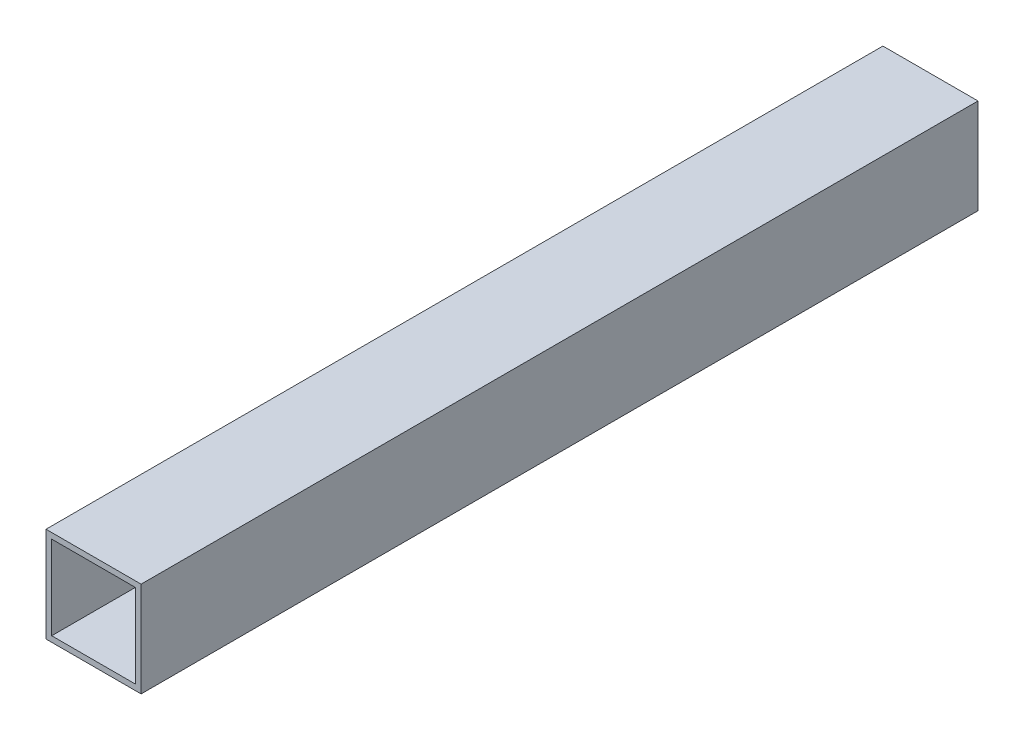
ISO-10303-21;
HEADER;
FILE_DESCRIPTION(('STEP AP214'),'2;1');
FILE_NAME('part.step','',(''),(''),'','','');
FILE_SCHEMA(('AUTOMOTIVE_DESIGN { 1 0 10303 214 1 1 1 1 }'));
ENDSEC;
DATA;
#1=APPLICATION_CONTEXT('core data for automotive mechanical design processes');
#2=APPLICATION_PROTOCOL_DEFINITION('international standard','automotive_design',2000,#1);
#3=PRODUCT_CONTEXT('',#1,'mechanical');
#4=PRODUCT('Part','Part','',(#3));
#5=PRODUCT_RELATED_PRODUCT_CATEGORY('part','',(#4));
#6=PRODUCT_DEFINITION_FORMATION('','',#4);
#7=PRODUCT_DEFINITION_CONTEXT('part definition',#1,'design');
#8=PRODUCT_DEFINITION('design','',#6,#7);
#9=PRODUCT_DEFINITION_SHAPE('','',#8);
#10=(LENGTH_UNIT() NAMED_UNIT(*) SI_UNIT(.MILLI.,.METRE.));
#11=(NAMED_UNIT(*) PLANE_ANGLE_UNIT() SI_UNIT($,.RADIAN.));
#12=(NAMED_UNIT(*) SI_UNIT($,.STERADIAN.) SOLID_ANGLE_UNIT());
#13=UNCERTAINTY_MEASURE_WITH_UNIT(LENGTH_MEASURE(1.E-05),#10,'distance_accuracy_value','');
#14=(GEOMETRIC_REPRESENTATION_CONTEXT(3) GLOBAL_UNCERTAINTY_ASSIGNED_CONTEXT((#13)) GLOBAL_UNIT_ASSIGNED_CONTEXT((#10,
#11,#12)) REPRESENTATION_CONTEXT('',''));
#15=CARTESIAN_POINT('',(0.,0.,0.));
#16=DIRECTION('',(0.,0.,1.));
#17=DIRECTION('',(1.,0.,0.));
#18=AXIS2_PLACEMENT_3D('',#15,#16,#17);
#19=CARTESIAN_POINT('',(0.,0.,220.));
#20=DIRECTION('',(0.,0.,1.));
#21=DIRECTION('',(1.,0.,0.));
#22=AXIS2_PLACEMENT_3D('',#19,#20,#21);
#23=PLANE('',#22);
#24=DIRECTION('',(0.,1.,0.));
#25=VECTOR('',#24,1.);
#26=CARTESIAN_POINT('',(12.5,-12.5,220.));
#27=LINE('',#26,#25);
#28=CARTESIAN_POINT('',(12.5,-12.5,220.));
#29=VERTEX_POINT('',#28);
#30=CARTESIAN_POINT('',(12.5,12.5,220.));
#31=VERTEX_POINT('',#30);
#32=EDGE_CURVE('E157',#29,#31,#27,.T.);
#33=ORIENTED_EDGE('',*,*,#32,.T.);
#34=DIRECTION('',(-1.,0.,0.));
#35=VECTOR('',#34,1.);
#36=CARTESIAN_POINT('',(-12.5,12.5,220.));
#37=LINE('',#36,#35);
#38=CARTESIAN_POINT('',(-12.5,12.5,220.));
#39=VERTEX_POINT('',#38);
#40=EDGE_CURVE('E160',#31,#39,#37,.T.);
#41=ORIENTED_EDGE('',*,*,#40,.T.);
#42=DIRECTION('',(0.,-1.,0.));
#43=VECTOR('',#42,1.);
#44=CARTESIAN_POINT('',(-12.5,-12.5,220.));
#45=LINE('',#44,#43);
#46=CARTESIAN_POINT('',(-12.5,-12.5,220.));
#47=VERTEX_POINT('',#46);
#48=EDGE_CURVE('E163',#39,#47,#45,.T.);
#49=ORIENTED_EDGE('',*,*,#48,.T.);
#50=DIRECTION('',(1.,0.,0.));
#51=VECTOR('',#50,1.);
#52=CARTESIAN_POINT('',(-12.5,-12.5,220.));
#53=LINE('',#52,#51);
#54=EDGE_CURVE('E165',#47,#29,#53,.T.);
#55=ORIENTED_EDGE('',*,*,#54,.T.);
#56=EDGE_LOOP('',(#33,#41,#49,#55));
#57=FACE_BOUND('',#56,.T.);
#58=DIRECTION('',(-1.,0.,0.));
#59=VECTOR('',#58,1.);
#60=CARTESIAN_POINT('',(0.,11.,220.));
#61=LINE('',#60,#59);
#62=CARTESIAN_POINT('',(11.,11.,220.));
#63=VERTEX_POINT('',#62);
#64=CARTESIAN_POINT('',(-11.,11.,220.));
#65=VERTEX_POINT('',#64);
#66=EDGE_CURVE('E129',#63,#65,#61,.T.);
#67=ORIENTED_EDGE('',*,*,#66,.F.);
#68=DIRECTION('',(0.,1.,0.));
#69=VECTOR('',#68,1.);
#70=CARTESIAN_POINT('',(11.,0.,220.));
#71=LINE('',#70,#69);
#72=CARTESIAN_POINT('',(11.,-11.,220.));
#73=VERTEX_POINT('',#72);
#74=EDGE_CURVE('E121',#73,#63,#71,.T.);
#75=ORIENTED_EDGE('',*,*,#74,.F.);
#76=DIRECTION('',(1.,0.,0.));
#77=VECTOR('',#76,1.);
#78=CARTESIAN_POINT('',(0.,-11.,220.));
#79=LINE('',#78,#77);
#80=CARTESIAN_POINT('',(-11.,-11.,220.));
#81=VERTEX_POINT('',#80);
#82=EDGE_CURVE('E143',#81,#73,#79,.T.);
#83=ORIENTED_EDGE('',*,*,#82,.F.);
#84=DIRECTION('',(0.,-1.,0.));
#85=VECTOR('',#84,1.);
#86=CARTESIAN_POINT('',(-11.,0.,220.));
#87=LINE('',#86,#85);
#88=EDGE_CURVE('E141',#65,#81,#87,.T.);
#89=ORIENTED_EDGE('',*,*,#88,.F.);
#90=EDGE_LOOP('',(#67,#75,#83,#89));
#91=FACE_BOUND('',#90,.T.);
#92=ADVANCED_FACE('F56',(#57,#91),#23,.T.);
#93=CARTESIAN_POINT('',(0.,0.,0.));
#94=DIRECTION('',(0.,0.,1.));
#95=DIRECTION('',(1.,0.,0.));
#96=AXIS2_PLACEMENT_3D('',#93,#94,#95);
#97=PLANE('',#96);
#98=DIRECTION('',(0.,1.,0.));
#99=VECTOR('',#98,1.);
#100=CARTESIAN_POINT('',(12.5,-12.5,0.));
#101=LINE('',#100,#99);
#102=CARTESIAN_POINT('',(12.5,-12.5,0.));
#103=VERTEX_POINT('',#102);
#104=CARTESIAN_POINT('',(12.5,12.5,0.));
#105=VERTEX_POINT('',#104);
#106=EDGE_CURVE('E137',#103,#105,#101,.T.);
#107=ORIENTED_EDGE('',*,*,#106,.F.);
#108=DIRECTION('',(1.,0.,0.));
#109=VECTOR('',#108,1.);
#110=CARTESIAN_POINT('',(-12.5,-12.5,0.));
#111=LINE('',#110,#109);
#112=CARTESIAN_POINT('',(-12.5,-12.5,0.));
#113=VERTEX_POINT('',#112);
#114=EDGE_CURVE('E161',#113,#103,#111,.T.);
#115=ORIENTED_EDGE('',*,*,#114,.F.);
#116=DIRECTION('',(0.,-1.,0.));
#117=VECTOR('',#116,1.);
#118=CARTESIAN_POINT('',(-12.5,-12.5,0.));
#119=LINE('',#118,#117);
#120=CARTESIAN_POINT('',(-12.5,12.5,0.));
#121=VERTEX_POINT('',#120);
#122=EDGE_CURVE('E172',#121,#113,#119,.T.);
#123=ORIENTED_EDGE('',*,*,#122,.F.);
#124=DIRECTION('',(-1.,0.,0.));
#125=VECTOR('',#124,1.);
#126=CARTESIAN_POINT('',(-12.5,12.5,0.));
#127=LINE('',#126,#125);
#128=EDGE_CURVE('E170',#105,#121,#127,.T.);
#129=ORIENTED_EDGE('',*,*,#128,.F.);
#130=EDGE_LOOP('',(#107,#115,#123,#129));
#131=FACE_BOUND('',#130,.T.);
#132=DIRECTION('',(0.,1.,0.));
#133=VECTOR('',#132,1.);
#134=CARTESIAN_POINT('',(11.,0.,0.));
#135=LINE('',#134,#133);
#136=CARTESIAN_POINT('',(11.,-11.,0.));
#137=VERTEX_POINT('',#136);
#138=CARTESIAN_POINT('',(11.,11.,0.));
#139=VERTEX_POINT('',#138);
#140=EDGE_CURVE('E79',#137,#139,#135,.T.);
#141=ORIENTED_EDGE('',*,*,#140,.T.);
#142=DIRECTION('',(-1.,0.,0.));
#143=VECTOR('',#142,1.);
#144=CARTESIAN_POINT('',(0.,11.,0.));
#145=LINE('',#144,#143);
#146=CARTESIAN_POINT('',(-11.,11.,0.));
#147=VERTEX_POINT('',#146);
#148=EDGE_CURVE('E136',#139,#147,#145,.T.);
#149=ORIENTED_EDGE('',*,*,#148,.T.);
#150=DIRECTION('',(0.,-1.,0.));
#151=VECTOR('',#150,1.);
#152=CARTESIAN_POINT('',(-11.,0.,0.));
#153=LINE('',#152,#151);
#154=CARTESIAN_POINT('',(-11.,-11.,0.));
#155=VERTEX_POINT('',#154);
#156=EDGE_CURVE('E149',#147,#155,#153,.T.);
#157=ORIENTED_EDGE('',*,*,#156,.T.);
#158=DIRECTION('',(1.,0.,0.));
#159=VECTOR('',#158,1.);
#160=CARTESIAN_POINT('',(0.,-11.,0.));
#161=LINE('',#160,#159);
#162=EDGE_CURVE('E130',#155,#137,#161,.T.);
#163=ORIENTED_EDGE('',*,*,#162,.T.);
#164=EDGE_LOOP('',(#141,#149,#157,#163));
#165=FACE_BOUND('',#164,.T.);
#166=ADVANCED_FACE('F190',(#131,#165),#97,.F.);
#167=CARTESIAN_POINT('',(12.5,-12.5,220.));
#168=DIRECTION('',(-1.,0.,0.));
#169=DIRECTION('',(0.,0.,1.));
#170=AXIS2_PLACEMENT_3D('',#167,#168,#169);
#171=PLANE('',#170);
#172=ORIENTED_EDGE('',*,*,#106,.T.);
#173=DIRECTION('',(0.,0.,-1.));
#174=VECTOR('',#173,1.);
#175=CARTESIAN_POINT('',(12.5,12.5,220.));
#176=LINE('',#175,#174);
#177=EDGE_CURVE('E12',#31,#105,#176,.T.);
#178=ORIENTED_EDGE('',*,*,#177,.F.);
#179=ORIENTED_EDGE('',*,*,#32,.F.);
#180=DIRECTION('',(0.,0.,-1.));
#181=VECTOR('',#180,1.);
#182=CARTESIAN_POINT('',(12.5,-12.5,220.));
#183=LINE('',#182,#181);
#184=EDGE_CURVE('E167',#29,#103,#183,.T.);
#185=ORIENTED_EDGE('',*,*,#184,.T.);
#186=EDGE_LOOP('',(#172,#178,#179,#185));
#187=FACE_BOUND('',#186,.T.);
#188=ADVANCED_FACE('F58',(#187),#171,.F.);
#189=CARTESIAN_POINT('',(-12.5,12.5,220.));
#190=DIRECTION('',(0.,-1.,0.));
#191=DIRECTION('',(0.,0.,-1.));
#192=AXIS2_PLACEMENT_3D('',#189,#190,#191);
#193=PLANE('',#192);
#194=ORIENTED_EDGE('',*,*,#128,.T.);
#195=DIRECTION('',(0.,0.,-1.));
#196=VECTOR('',#195,1.);
#197=CARTESIAN_POINT('',(-12.5,12.5,220.));
#198=LINE('',#197,#196);
#199=EDGE_CURVE('E64',#39,#121,#198,.T.);
#200=ORIENTED_EDGE('',*,*,#199,.F.);
#201=ORIENTED_EDGE('',*,*,#40,.F.);
#202=ORIENTED_EDGE('',*,*,#177,.T.);
#203=EDGE_LOOP('',(#194,#200,#201,#202));
#204=FACE_BOUND('',#203,.T.);
#205=ADVANCED_FACE('F200',(#204),#193,.F.);
#206=CARTESIAN_POINT('',(-12.5,-12.5,220.));
#207=DIRECTION('',(1.,0.,0.));
#208=DIRECTION('',(0.,0.,-1.));
#209=AXIS2_PLACEMENT_3D('',#206,#207,#208);
#210=PLANE('',#209);
#211=ORIENTED_EDGE('',*,*,#122,.T.);
#212=DIRECTION('',(0.,0.,-1.));
#213=VECTOR('',#212,1.);
#214=CARTESIAN_POINT('',(-12.5,-12.5,220.));
#215=LINE('',#214,#213);
#216=EDGE_CURVE('E177',#47,#113,#215,.T.);
#217=ORIENTED_EDGE('',*,*,#216,.F.);
#218=ORIENTED_EDGE('',*,*,#48,.F.);
#219=ORIENTED_EDGE('',*,*,#199,.T.);
#220=EDGE_LOOP('',(#211,#217,#218,#219));
#221=FACE_BOUND('',#220,.T.);
#222=ADVANCED_FACE('F184',(#221),#210,.F.);
#223=CARTESIAN_POINT('',(-12.5,-12.5,220.));
#224=DIRECTION('',(0.,1.,0.));
#225=DIRECTION('',(0.,0.,1.));
#226=AXIS2_PLACEMENT_3D('',#223,#224,#225);
#227=PLANE('',#226);
#228=ORIENTED_EDGE('',*,*,#114,.T.);
#229=ORIENTED_EDGE('',*,*,#184,.F.);
#230=ORIENTED_EDGE('',*,*,#54,.F.);
#231=ORIENTED_EDGE('',*,*,#216,.T.);
#232=EDGE_LOOP('',(#228,#229,#230,#231));
#233=FACE_BOUND('',#232,.T.);
#234=ADVANCED_FACE('F194',(#233),#227,.F.);
#235=CARTESIAN_POINT('',(11.,0.,220.));
#236=DIRECTION('',(-1.,0.,0.));
#237=DIRECTION('',(0.,0.,1.));
#238=AXIS2_PLACEMENT_3D('',#235,#236,#237);
#239=PLANE('',#238);
#240=ORIENTED_EDGE('',*,*,#140,.F.);
#241=DIRECTION('',(0.,0.,-1.));
#242=VECTOR('',#241,1.);
#243=CARTESIAN_POINT('',(11.,-11.,220.));
#244=LINE('',#243,#242);
#245=EDGE_CURVE('E125',#73,#137,#244,.T.);
#246=ORIENTED_EDGE('',*,*,#245,.F.);
#247=ORIENTED_EDGE('',*,*,#74,.T.);
#248=DIRECTION('',(0.,0.,-1.));
#249=VECTOR('',#248,1.);
#250=CARTESIAN_POINT('',(11.,11.,220.));
#251=LINE('',#250,#249);
#252=EDGE_CURVE('E124',#63,#139,#251,.T.);
#253=ORIENTED_EDGE('',*,*,#252,.T.);
#254=EDGE_LOOP('',(#240,#246,#247,#253));
#255=FACE_BOUND('',#254,.T.);
#256=ADVANCED_FACE('F123',(#255),#239,.T.);
#257=CARTESIAN_POINT('',(0.,11.,220.));
#258=DIRECTION('',(0.,-1.,0.));
#259=DIRECTION('',(0.,0.,-1.));
#260=AXIS2_PLACEMENT_3D('',#257,#258,#259);
#261=PLANE('',#260);
#262=ORIENTED_EDGE('',*,*,#148,.F.);
#263=ORIENTED_EDGE('',*,*,#252,.F.);
#264=ORIENTED_EDGE('',*,*,#66,.T.);
#265=DIRECTION('',(0.,0.,-1.));
#266=VECTOR('',#265,1.);
#267=CARTESIAN_POINT('',(-11.,11.,220.));
#268=LINE('',#267,#266);
#269=EDGE_CURVE('E138',#65,#147,#268,.T.);
#270=ORIENTED_EDGE('',*,*,#269,.T.);
#271=EDGE_LOOP('',(#262,#263,#264,#270));
#272=FACE_BOUND('',#271,.T.);
#273=ADVANCED_FACE('F133',(#272),#261,.T.);
#274=CARTESIAN_POINT('',(-11.,0.,220.));
#275=DIRECTION('',(1.,0.,0.));
#276=DIRECTION('',(0.,0.,-1.));
#277=AXIS2_PLACEMENT_3D('',#274,#275,#276);
#278=PLANE('',#277);
#279=ORIENTED_EDGE('',*,*,#156,.F.);
#280=ORIENTED_EDGE('',*,*,#269,.F.);
#281=ORIENTED_EDGE('',*,*,#88,.T.);
#282=DIRECTION('',(0.,0.,-1.));
#283=VECTOR('',#282,1.);
#284=CARTESIAN_POINT('',(-11.,-11.,220.));
#285=LINE('',#284,#283);
#286=EDGE_CURVE('E71',#81,#155,#285,.T.);
#287=ORIENTED_EDGE('',*,*,#286,.T.);
#288=EDGE_LOOP('',(#279,#280,#281,#287));
#289=FACE_BOUND('',#288,.T.);
#290=ADVANCED_FACE('F223',(#289),#278,.T.);
#291=CARTESIAN_POINT('',(0.,-11.,220.));
#292=DIRECTION('',(0.,1.,0.));
#293=DIRECTION('',(0.,0.,1.));
#294=AXIS2_PLACEMENT_3D('',#291,#292,#293);
#295=PLANE('',#294);
#296=ORIENTED_EDGE('',*,*,#162,.F.);
#297=ORIENTED_EDGE('',*,*,#286,.F.);
#298=ORIENTED_EDGE('',*,*,#82,.T.);
#299=ORIENTED_EDGE('',*,*,#245,.T.);
#300=EDGE_LOOP('',(#296,#297,#298,#299));
#301=FACE_BOUND('',#300,.T.);
#302=ADVANCED_FACE('F227',(#301),#295,.T.);
#303=CLOSED_SHELL('',(#92,#166,#188,#205,#222,#234,#256,#273,#290,#302));
#304=MANIFOLD_SOLID_BREP('B2',#303);
#305=ADVANCED_BREP_SHAPE_REPRESENTATION('',(#18,#304),#14);
#306=SHAPE_DEFINITION_REPRESENTATION(#9,#305);
ENDSEC;
END-ISO-10303-21;
